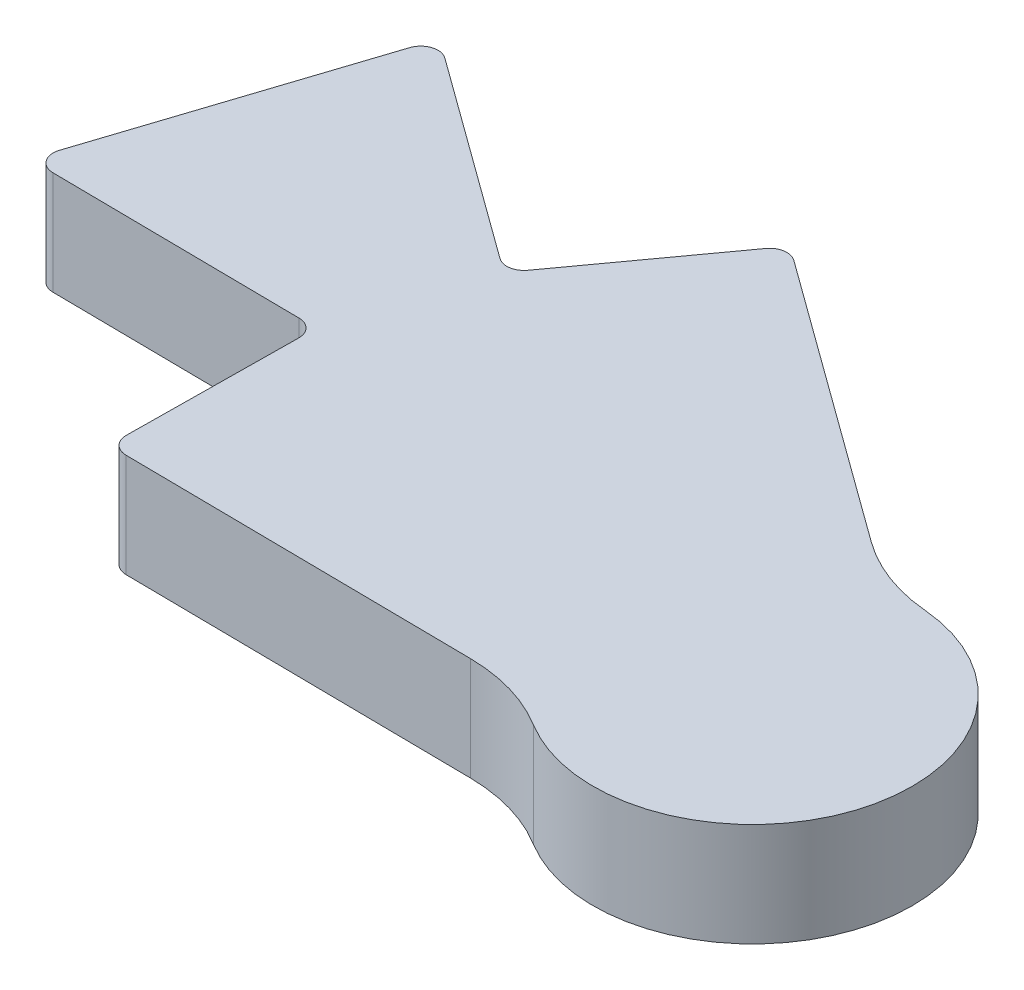
ISO-10303-21;
HEADER;
FILE_DESCRIPTION(('STEP AP214'),'2;1');
FILE_NAME('part.step','',(''),(''),'','','');
FILE_SCHEMA(('AUTOMOTIVE_DESIGN { 1 0 10303 214 1 1 1 1 }'));
ENDSEC;
DATA;
#1=APPLICATION_CONTEXT('core data for automotive mechanical design processes');
#2=APPLICATION_PROTOCOL_DEFINITION('international standard','automotive_design',2000,#1);
#3=PRODUCT_CONTEXT('',#1,'mechanical');
#4=PRODUCT('Part','Part','',(#3));
#5=PRODUCT_RELATED_PRODUCT_CATEGORY('part','',(#4));
#6=PRODUCT_DEFINITION_FORMATION('','',#4);
#7=PRODUCT_DEFINITION_CONTEXT('part definition',#1,'design');
#8=PRODUCT_DEFINITION('design','',#6,#7);
#9=PRODUCT_DEFINITION_SHAPE('','',#8);
#10=(LENGTH_UNIT() NAMED_UNIT(*) SI_UNIT(.MILLI.,.METRE.));
#11=(NAMED_UNIT(*) PLANE_ANGLE_UNIT() SI_UNIT($,.RADIAN.));
#12=(NAMED_UNIT(*) SI_UNIT($,.STERADIAN.) SOLID_ANGLE_UNIT());
#13=UNCERTAINTY_MEASURE_WITH_UNIT(LENGTH_MEASURE(1.E-05),#10,'distance_accuracy_value','');
#14=(GEOMETRIC_REPRESENTATION_CONTEXT(3) GLOBAL_UNCERTAINTY_ASSIGNED_CONTEXT((#13)) GLOBAL_UNIT_ASSIGNED_CONTEXT((#10,
#11,#12)) REPRESENTATION_CONTEXT('',''));
#15=CARTESIAN_POINT('',(0.,0.,0.));
#16=DIRECTION('',(0.,0.,1.));
#17=DIRECTION('',(1.,0.,0.));
#18=AXIS2_PLACEMENT_3D('',#15,#16,#17);
#19=CARTESIAN_POINT('',(-45.4404288981152,-113.282323344771,-24.3949893348608));
#20=DIRECTION('',(0.,1.,0.));
#21=DIRECTION('',(0.,0.,1.));
#22=AXIS2_PLACEMENT_3D('',#19,#20,#21);
#23=CYLINDRICAL_SURFACE('',#22,1.5875);
#24=CARTESIAN_POINT('',(-45.4404288981152,-9.52499999999999,-24.3949893348608));
#25=DIRECTION('',(0.,1.,0.));
#26=DIRECTION('',(0.,0.,1.));
#27=AXIS2_PLACEMENT_3D('',#24,#25,#26);
#28=CIRCLE('',#27,1.5875);
#29=CARTESIAN_POINT('',(-46.3730351959528,-9.52500000000001,-23.1103097081704));
#30=VERTEX_POINT('',#29);
#31=CARTESIAN_POINT('',(-44.1557492714247,-9.525,-23.4623830370232));
#32=VERTEX_POINT('',#31);
#33=EDGE_CURVE('E46',#30,#32,#28,.T.);
#34=ORIENTED_EDGE('',*,*,#33,.F.);
#35=DIRECTION('',(0.,1.,0.));
#36=VECTOR('',#35,1.);
#37=CARTESIAN_POINT('',(-46.3730351959528,-113.282323344771,-23.1103097081704));
#38=LINE('',#37,#36);
#39=CARTESIAN_POINT('',(-46.3730351959528,0.,-23.1103097081704));
#40=VERTEX_POINT('',#39);
#41=EDGE_CURVE('E149',#30,#40,#38,.T.);
#42=ORIENTED_EDGE('',*,*,#41,.T.);
#43=CARTESIAN_POINT('',(-45.4404288981152,0.,-24.3949893348608));
#44=DIRECTION('',(0.,-1.,0.));
#45=DIRECTION('',(0.,0.,1.));
#46=AXIS2_PLACEMENT_3D('',#43,#44,#45);
#47=CIRCLE('',#46,1.5875);
#48=CARTESIAN_POINT('',(-44.1557492714247,0.,-23.4623830370232));
#49=VERTEX_POINT('',#48);
#50=EDGE_CURVE('E153',#49,#40,#47,.T.);
#51=ORIENTED_EDGE('',*,*,#50,.F.);
#52=DIRECTION('',(0.,1.,0.));
#53=VECTOR('',#52,1.);
#54=CARTESIAN_POINT('',(-44.1557492714247,-113.282323344771,-23.4623830370232));
#55=LINE('',#54,#53);
#56=EDGE_CURVE('E212',#32,#49,#55,.T.);
#57=ORIENTED_EDGE('',*,*,#56,.F.);
#58=EDGE_LOOP('',(#34,#42,#51,#57));
#59=FACE_BOUND('',#58,.T.);
#60=ADVANCED_FACE('F39',(#59),#23,.F.);
#61=CARTESIAN_POINT('',(-34.941599048791,-113.282323344771,-36.1550177487226));
#62=DIRECTION('',(-0.809247008938891,0.,-0.58746853407094));
#63=DIRECTION('',(-0.58746853407094,0.,0.809247008938891));
#64=AXIS2_PLACEMENT_3D('',#61,#62,#63);
#65=PLANE('',#64);
#66=DIRECTION('',(0.58746853407094,0.,-0.809247008938891));
#67=VECTOR('',#66,1.);
#68=CARTESIAN_POINT('',(-34.9415990487915,-9.52499999999987,-36.1550177487219));
#69=LINE('',#68,#67);
#70=CARTESIAN_POINT('',(-34.941599048791,-9.52499999999985,-36.1550177487226));
#71=VERTEX_POINT('',#70);
#72=EDGE_CURVE('E312',#32,#71,#69,.T.);
#73=ORIENTED_EDGE('',*,*,#72,.F.);
#74=ORIENTED_EDGE('',*,*,#56,.T.);
#75=DIRECTION('',(-0.58746853407094,0.,0.809247008938891));
#76=VECTOR('',#75,1.);
#77=CARTESIAN_POINT('',(-34.941599048791,0.,-36.1550177487226));
#78=LINE('',#77,#76);
#79=CARTESIAN_POINT('',(-34.941599048791,0.,-36.1550177487226));
#80=VERTEX_POINT('',#79);
#81=EDGE_CURVE('E158',#80,#49,#78,.T.);
#82=ORIENTED_EDGE('',*,*,#81,.F.);
#83=DIRECTION('',(0.,1.,0.));
#84=VECTOR('',#83,1.);
#85=CARTESIAN_POINT('',(-34.941599048791,-113.282323344771,-36.1550177487226));
#86=LINE('',#85,#84);
#87=EDGE_CURVE('E215',#71,#80,#86,.T.);
#88=ORIENTED_EDGE('',*,*,#87,.F.);
#89=EDGE_LOOP('',(#73,#74,#82,#88));
#90=FACE_BOUND('',#89,.T.);
#91=ADVANCED_FACE('F311',(#90),#65,.T.);
#92=CARTESIAN_POINT('',(-33.6569194221005,-113.282323344771,-35.222411450885));
#93=DIRECTION('',(0.,1.,0.));
#94=DIRECTION('',(0.,0.,1.));
#95=AXIS2_PLACEMENT_3D('',#92,#93,#94);
#96=CYLINDRICAL_SURFACE('',#95,1.5875);
#97=CARTESIAN_POINT('',(-33.6569194221005,-9.52499999999985,-35.222411450885));
#98=DIRECTION('',(0.,1.,0.));
#99=DIRECTION('',(0.,0.,1.));
#100=AXIS2_PLACEMENT_3D('',#97,#98,#99);
#101=CIRCLE('',#100,1.5875);
#102=CARTESIAN_POINT('',(-32.7243131242629,-9.52499999999986,-36.5070910775755));
#103=VERTEX_POINT('',#102);
#104=EDGE_CURVE('E308',#71,#103,#101,.F.);
#105=ORIENTED_EDGE('',*,*,#104,.F.);
#106=ORIENTED_EDGE('',*,*,#87,.T.);
#107=CARTESIAN_POINT('',(-33.6569194221005,0.,-35.222411450885));
#108=DIRECTION('',(0.,1.,0.));
#109=DIRECTION('',(0.,0.,1.));
#110=AXIS2_PLACEMENT_3D('',#107,#108,#109);
#111=CIRCLE('',#110,1.5875);
#112=CARTESIAN_POINT('',(-32.7243131242629,0.,-36.5070910775755));
#113=VERTEX_POINT('',#112);
#114=EDGE_CURVE('E209',#113,#80,#111,.T.);
#115=ORIENTED_EDGE('',*,*,#114,.F.);
#116=DIRECTION('',(0.,1.,0.));
#117=VECTOR('',#116,1.);
#118=CARTESIAN_POINT('',(-32.7243131242629,-113.282323344771,-36.5070910775755));
#119=LINE('',#118,#117);
#120=EDGE_CURVE('E217',#103,#113,#119,.T.);
#121=ORIENTED_EDGE('',*,*,#120,.F.);
#122=EDGE_LOOP('',(#105,#106,#115,#121));
#123=FACE_BOUND('',#122,.T.);
#124=ADVANCED_FACE('F306',(#123),#96,.T.);
#125=CARTESIAN_POINT('',(-6.67101029497955,-113.282323344771,-17.5938353574284));
#126=DIRECTION('',(0.587468534070942,0.,-0.809247008938889));
#127=DIRECTION('',(-0.809247008938889,0.,-0.587468534070942));
#128=AXIS2_PLACEMENT_3D('',#125,#126,#127);
#129=PLANE('',#128);
#130=DIRECTION('',(0.809247008938889,0.,0.587468534070942));
#131=VECTOR('',#130,1.);
#132=CARTESIAN_POINT('',(-6.67101029497945,-9.5249999999999,-17.5938353574283));
#133=LINE('',#132,#131);
#134=CARTESIAN_POINT('',(-6.67101029497957,-9.52499999999989,-17.5938353574283));
#135=VERTEX_POINT('',#134);
#136=EDGE_CURVE('E303',#103,#135,#133,.T.);
#137=ORIENTED_EDGE('',*,*,#136,.F.);
#138=ORIENTED_EDGE('',*,*,#120,.T.);
#139=DIRECTION('',(-0.809247008938889,0.,-0.587468534070941));
#140=VECTOR('',#139,1.);
#141=CARTESIAN_POINT('',(-6.67101029497955,0.,-17.5938353574284));
#142=LINE('',#141,#140);
#143=CARTESIAN_POINT('',(-6.67101029497957,0.,-17.5938353574283));
#144=VERTEX_POINT('',#143);
#145=EDGE_CURVE('E206',#144,#113,#142,.T.);
#146=ORIENTED_EDGE('',*,*,#145,.F.);
#147=DIRECTION('',(0.,1.,0.));
#148=VECTOR('',#147,1.);
#149=CARTESIAN_POINT('',(-6.67101029497957,-113.282323344771,-17.5938353574283));
#150=LINE('',#149,#148);
#151=EDGE_CURVE('E219',#135,#144,#150,.T.);
#152=ORIENTED_EDGE('',*,*,#151,.F.);
#153=EDGE_LOOP('',(#137,#138,#146,#152));
#154=FACE_BOUND('',#153,.T.);
#155=ADVANCED_FACE('F301',(#154),#129,.T.);
#156=CARTESIAN_POINT('',(2.65505268339514,-113.282323344771,-30.4406316243323));
#157=DIRECTION('',(0.,1.,0.));
#158=DIRECTION('',(0.,0.,1.));
#159=AXIS2_PLACEMENT_3D('',#156,#157,#158);
#160=CYLINDRICAL_SURFACE('',#159,15.8749999999984);
#161=CARTESIAN_POINT('',(2.65505268339514,-9.52499999999976,-30.4406316243323));
#162=DIRECTION('',(0.,1.,0.));
#163=DIRECTION('',(0.,0.,1.));
#164=AXIS2_PLACEMENT_3D('',#161,#162,#163);
#165=CIRCLE('',#164,15.8749999999984);
#166=CARTESIAN_POINT('',(1.27566122277845,-9.52499999999988,-14.6256733822652));
#167=VERTEX_POINT('',#166);
#168=EDGE_CURVE('E316',#135,#167,#165,.T.);
#169=ORIENTED_EDGE('',*,*,#168,.F.);
#170=ORIENTED_EDGE('',*,*,#151,.T.);
#171=CARTESIAN_POINT('',(2.65505268339514,0.,-30.4406316243323));
#172=DIRECTION('',(0.,-1.,0.));
#173=DIRECTION('',(0.,0.,1.));
#174=AXIS2_PLACEMENT_3D('',#171,#172,#173);
#175=CIRCLE('',#174,15.8749999999984);
#176=CARTESIAN_POINT('',(1.27566122277845,0.,-14.6256733822652));
#177=VERTEX_POINT('',#176);
#178=EDGE_CURVE('E203',#177,#144,#175,.T.);
#179=ORIENTED_EDGE('',*,*,#178,.F.);
#180=DIRECTION('',(0.,1.,0.));
#181=VECTOR('',#180,1.);
#182=CARTESIAN_POINT('',(1.27566122277845,-113.282323344771,-14.6256733822652));
#183=LINE('',#182,#181);
#184=EDGE_CURVE('E221',#167,#177,#183,.T.);
#185=ORIENTED_EDGE('',*,*,#184,.F.);
#186=EDGE_LOOP('',(#169,#170,#179,#185));
#187=FACE_BOUND('',#186,.T.);
#188=ADVANCED_FACE('F295',(#187),#160,.F.);
#189=CARTESIAN_POINT('',(0.,-113.282323344771,0.));
#190=DIRECTION('',(0.,1.,0.));
#191=DIRECTION('',(0.,0.,1.));
#192=AXIS2_PLACEMENT_3D('',#189,#190,#191);
#193=CYLINDRICAL_SURFACE('',#192,14.6812);
#194=CARTESIAN_POINT('',(0.,-9.52499999999999,0.));
#195=DIRECTION('',(0.,1.,0.));
#196=DIRECTION('',(0.,0.,1.));
#197=AXIS2_PLACEMENT_3D('',#194,#195,#196);
#198=CIRCLE('',#197,14.6812);
#199=CARTESIAN_POINT('',(-7.70155333243296,-9.52500000000011,12.4989483440684));
#200=VERTEX_POINT('',#199);
#201=EDGE_CURVE('E292',#167,#200,#198,.F.);
#202=ORIENTED_EDGE('',*,*,#201,.F.);
#203=ORIENTED_EDGE('',*,*,#184,.T.);
#204=CARTESIAN_POINT('',(0.,0.,0.));
#205=DIRECTION('',(0.,1.,0.));
#206=DIRECTION('',(0.,0.,1.));
#207=AXIS2_PLACEMENT_3D('',#204,#205,#206);
#208=CIRCLE('',#207,14.6812);
#209=CARTESIAN_POINT('',(-7.70155333243296,0.,12.4989483440684));
#210=VERTEX_POINT('',#209);
#211=EDGE_CURVE('E200',#210,#177,#208,.T.);
#212=ORIENTED_EDGE('',*,*,#211,.F.);
#213=DIRECTION('',(0.,1.,0.));
#214=VECTOR('',#213,1.);
#215=CARTESIAN_POINT('',(-7.70155333243296,-113.282323344771,12.4989483440684));
#216=LINE('',#215,#214);
#217=EDGE_CURVE('E223',#200,#210,#216,.T.);
#218=ORIENTED_EDGE('',*,*,#217,.F.);
#219=EDGE_LOOP('',(#202,#203,#212,#218));
#220=FACE_BOUND('',#219,.T.);
#221=ADVANCED_FACE('F289',(#220),#193,.T.);
#222=CARTESIAN_POINT('',(-16.0293575413778,-113.282323344771,26.01424715902));
#223=DIRECTION('',(0.,1.,0.));
#224=DIRECTION('',(0.,0.,1.));
#225=AXIS2_PLACEMENT_3D('',#222,#223,#224);
#226=CYLINDRICAL_SURFACE('',#225,15.8749999999984);
#227=CARTESIAN_POINT('',(-16.0293575413778,-9.52500000000024,26.01424715902));
#228=DIRECTION('',(0.,1.,0.));
#229=DIRECTION('',(0.,0.,1.));
#230=AXIS2_PLACEMENT_3D('',#227,#228,#229);
#231=CIRCLE('',#230,15.8749999999984);
#232=CARTESIAN_POINT('',(-15.8499377236947,-9.52500000000012,10.1402610959994));
#233=VERTEX_POINT('',#232);
#234=EDGE_CURVE('E286',#200,#233,#231,.T.);
#235=ORIENTED_EDGE('',*,*,#234,.F.);
#236=ORIENTED_EDGE('',*,*,#217,.T.);
#237=CARTESIAN_POINT('',(-16.0293575413778,0.,26.01424715902));
#238=DIRECTION('',(0.,-1.,0.));
#239=DIRECTION('',(0.,0.,1.));
#240=AXIS2_PLACEMENT_3D('',#237,#238,#239);
#241=CIRCLE('',#240,15.8749999999984);
#242=CARTESIAN_POINT('',(-15.8499377236947,0.,10.1402610959994));
#243=VERTEX_POINT('',#242);
#244=EDGE_CURVE('E197',#243,#210,#241,.T.);
#245=ORIENTED_EDGE('',*,*,#244,.F.);
#246=DIRECTION('',(0.,1.,0.));
#247=VECTOR('',#246,1.);
#248=CARTESIAN_POINT('',(-15.8499377236947,-113.282323344771,10.1402610959994));
#249=LINE('',#248,#247);
#250=EDGE_CURVE('E225',#233,#243,#249,.T.);
#251=ORIENTED_EDGE('',*,*,#250,.F.);
#252=EDGE_LOOP('',(#235,#236,#245,#251));
#253=FACE_BOUND('',#252,.T.);
#254=ADVANCED_FACE('F284',(#253),#226,.F.);
#255=CARTESIAN_POINT('',(-47.9153895709995,-113.282323344771,9.77783306427944));
#256=DIRECTION('',(-0.0113020357595672,0.,0.999936129954153));
#257=DIRECTION('',(0.999936129954153,0.,0.0113020357595672));
#258=AXIS2_PLACEMENT_3D('',#255,#256,#257);
#259=PLANE('',#258);
#260=DIRECTION('',(-0.999936129954153,0.,-0.0113020357595672));
#261=VECTOR('',#260,1.);
#262=CARTESIAN_POINT('',(-47.9153895709999,-9.52500000000024,9.77783306427943));
#263=LINE('',#262,#261);
#264=CARTESIAN_POINT('',(-47.9153895709995,-9.52500000000024,9.77783306427944));
#265=VERTEX_POINT('',#264);
#266=EDGE_CURVE('E320',#233,#265,#263,.T.);
#267=ORIENTED_EDGE('',*,*,#266,.F.);
#268=ORIENTED_EDGE('',*,*,#250,.T.);
#269=DIRECTION('',(0.999936129954153,0.,0.0113020357595672));
#270=VECTOR('',#269,1.);
#271=CARTESIAN_POINT('',(-47.9153895709995,0.,9.77783306427944));
#272=LINE('',#271,#270);
#273=CARTESIAN_POINT('',(-47.9153895709995,0.,9.77783306427944));
#274=VERTEX_POINT('',#273);
#275=EDGE_CURVE('E194',#274,#243,#272,.T.);
#276=ORIENTED_EDGE('',*,*,#275,.F.);
#277=DIRECTION('',(0.,1.,0.));
#278=VECTOR('',#277,1.);
#279=CARTESIAN_POINT('',(-47.9153895709995,-113.282323344771,9.77783306427944));
#280=LINE('',#279,#278);
#281=EDGE_CURVE('E227',#265,#274,#280,.T.);
#282=ORIENTED_EDGE('',*,*,#281,.F.);
#283=EDGE_LOOP('',(#267,#268,#276,#282));
#284=FACE_BOUND('',#283,.T.);
#285=ADVANCED_FACE('F278',(#284),#259,.T.);
#286=CARTESIAN_POINT('',(-47.8974475892312,-113.282323344771,8.19043445797722));
#287=DIRECTION('',(0.,1.,0.));
#288=DIRECTION('',(0.,0.,1.));
#289=AXIS2_PLACEMENT_3D('',#286,#287,#288);
#290=CYLINDRICAL_SURFACE('',#289,1.5875);
#291=CARTESIAN_POINT('',(-47.8974475892312,-9.52500000000023,8.19043445797722));
#292=DIRECTION('',(0.,1.,0.));
#293=DIRECTION('',(0.,0.,1.));
#294=AXIS2_PLACEMENT_3D('',#291,#292,#293);
#295=CIRCLE('',#294,1.5875);
#296=CARTESIAN_POINT('',(-49.4848461955334,-9.52500000000025,8.1724924762089));
#297=VERTEX_POINT('',#296);
#298=EDGE_CURVE('E275',#265,#297,#295,.F.);
#299=ORIENTED_EDGE('',*,*,#298,.F.);
#300=ORIENTED_EDGE('',*,*,#281,.T.);
#301=CARTESIAN_POINT('',(-47.8974475892312,0.,8.19043445797722));
#302=DIRECTION('',(0.,1.,0.));
#303=DIRECTION('',(0.,0.,1.));
#304=AXIS2_PLACEMENT_3D('',#301,#302,#303);
#305=CIRCLE('',#304,1.5875);
#306=CARTESIAN_POINT('',(-49.4848461955334,0.,8.1724924762089));
#307=VERTEX_POINT('',#306);
#308=EDGE_CURVE('E191',#307,#274,#305,.T.);
#309=ORIENTED_EDGE('',*,*,#308,.F.);
#310=DIRECTION('',(0.,1.,0.));
#311=VECTOR('',#310,1.);
#312=CARTESIAN_POINT('',(-49.4848461955334,-113.282323344771,8.1724924762089));
#313=LINE('',#312,#311);
#314=EDGE_CURVE('E229',#297,#307,#313,.T.);
#315=ORIENTED_EDGE('',*,*,#314,.F.);
#316=EDGE_LOOP('',(#299,#300,#309,#315));
#317=FACE_BOUND('',#316,.T.);
#318=ADVANCED_FACE('F272',(#317),#290,.T.);
#319=CARTESIAN_POINT('',(-49.3075794156626,-113.282323344771,-7.5110057540538));
#320=DIRECTION('',(-0.999936129954153,0.,-0.0113020357595675));
#321=DIRECTION('',(-0.0113020357595675,0.,0.999936129954153));
#322=AXIS2_PLACEMENT_3D('',#319,#320,#321);
#323=PLANE('',#322);
#324=DIRECTION('',(0.0113020357595675,0.,-0.999936129954153));
#325=VECTOR('',#324,1.);
#326=CARTESIAN_POINT('',(-49.3075794156626,-9.52500000000013,-7.51100575405304));
#327=LINE('',#326,#325);
#328=CARTESIAN_POINT('',(-49.3075794156626,-9.52500000000012,-7.5110057540538));
#329=VERTEX_POINT('',#328);
#330=EDGE_CURVE('E269',#297,#329,#327,.T.);
#331=ORIENTED_EDGE('',*,*,#330,.F.);
#332=ORIENTED_EDGE('',*,*,#314,.T.);
#333=DIRECTION('',(-0.0113020357595675,0.,0.999936129954153));
#334=VECTOR('',#333,1.);
#335=CARTESIAN_POINT('',(-49.3075794156626,0.,-7.5110057540538));
#336=LINE('',#335,#334);
#337=CARTESIAN_POINT('',(-49.3075794156626,0.,-7.5110057540538));
#338=VERTEX_POINT('',#337);
#339=EDGE_CURVE('E188',#338,#307,#336,.T.);
#340=ORIENTED_EDGE('',*,*,#339,.F.);
#341=DIRECTION('',(0.,1.,0.));
#342=VECTOR('',#341,1.);
#343=CARTESIAN_POINT('',(-49.3075794156626,-113.282323344771,-7.5110057540538));
#344=LINE('',#343,#342);
#345=EDGE_CURVE('E231',#329,#338,#344,.T.);
#346=ORIENTED_EDGE('',*,*,#345,.F.);
#347=EDGE_LOOP('',(#331,#332,#340,#346));
#348=FACE_BOUND('',#347,.T.);
#349=ADVANCED_FACE('F267',(#348),#323,.T.);
#350=CARTESIAN_POINT('',(-50.8949780219648,-113.282323344771,-7.52894773582211));
#351=DIRECTION('',(0.,1.,0.));
#352=DIRECTION('',(0.,0.,1.));
#353=AXIS2_PLACEMENT_3D('',#350,#351,#352);
#354=CYLINDRICAL_SURFACE('',#353,1.5875);
#355=CARTESIAN_POINT('',(-50.8949780219648,-9.52500000000013,-7.52894773582211));
#356=DIRECTION('',(0.,1.,0.));
#357=DIRECTION('',(0.,0.,1.));
#358=AXIS2_PLACEMENT_3D('',#355,#356,#357);
#359=CIRCLE('',#358,1.5875);
#360=CARTESIAN_POINT('',(-50.8770360401964,-9.52500000000013,-9.11634634212433));
#361=VERTEX_POINT('',#360);
#362=EDGE_CURVE('E324',#329,#361,#359,.T.);
#363=ORIENTED_EDGE('',*,*,#362,.F.);
#364=ORIENTED_EDGE('',*,*,#345,.T.);
#365=CARTESIAN_POINT('',(-50.8949780219648,0.,-7.52894773582211));
#366=DIRECTION('',(0.,-1.,0.));
#367=DIRECTION('',(0.,0.,1.));
#368=AXIS2_PLACEMENT_3D('',#365,#366,#367);
#369=CIRCLE('',#368,1.5875);
#370=CARTESIAN_POINT('',(-50.8770360401964,0.,-9.11634634212433));
#371=VERTEX_POINT('',#370);
#372=EDGE_CURVE('E185',#371,#338,#369,.T.);
#373=ORIENTED_EDGE('',*,*,#372,.F.);
#374=DIRECTION('',(0.,1.,0.));
#375=VECTOR('',#374,1.);
#376=CARTESIAN_POINT('',(-50.8770360401964,-113.282323344771,-9.11634634212433));
#377=LINE('',#376,#375);
#378=EDGE_CURVE('E233',#361,#371,#377,.T.);
#379=ORIENTED_EDGE('',*,*,#378,.F.);
#380=EDGE_LOOP('',(#363,#364,#373,#379));
#381=FACE_BOUND('',#380,.T.);
#382=ADVANCED_FACE('F261',(#381),#354,.F.);
#383=CARTESIAN_POINT('',(-73.7956363051794,-113.282323344771,-9.37538972699128));
#384=DIRECTION('',(-0.0113020357595678,0.,0.999936129954153));
#385=DIRECTION('',(0.999936129954153,0.,0.0113020357595678));
#386=AXIS2_PLACEMENT_3D('',#383,#384,#385);
#387=PLANE('',#386);
#388=DIRECTION('',(-0.999936129954153,0.,-0.0113020357595678));
#389=VECTOR('',#388,1.);
#390=CARTESIAN_POINT('',(-73.7956363051798,-9.52500000000021,-9.37538972699128));
#391=LINE('',#390,#389);
#392=CARTESIAN_POINT('',(-73.7956363051794,-9.52500000000021,-9.37538972699128));
#393=VERTEX_POINT('',#392);
#394=EDGE_CURVE('E258',#361,#393,#391,.T.);
#395=ORIENTED_EDGE('',*,*,#394,.F.);
#396=ORIENTED_EDGE('',*,*,#378,.T.);
#397=DIRECTION('',(0.999936129954153,0.,0.0113020357595678));
#398=VECTOR('',#397,1.);
#399=CARTESIAN_POINT('',(-73.7956363051794,0.,-9.37538972699128));
#400=LINE('',#399,#398);
#401=CARTESIAN_POINT('',(-73.7956363051794,0.,-9.37538972699128));
#402=VERTEX_POINT('',#401);
#403=EDGE_CURVE('E182',#402,#371,#400,.T.);
#404=ORIENTED_EDGE('',*,*,#403,.F.);
#405=DIRECTION('',(0.,1.,0.));
#406=VECTOR('',#405,1.);
#407=CARTESIAN_POINT('',(-73.7956363051794,-113.282323344771,-9.37538972699128));
#408=LINE('',#407,#406);
#409=EDGE_CURVE('E235',#393,#402,#408,.T.);
#410=ORIENTED_EDGE('',*,*,#409,.F.);
#411=EDGE_LOOP('',(#395,#396,#404,#410));
#412=FACE_BOUND('',#411,.T.);
#413=ADVANCED_FACE('F255',(#412),#387,.T.);
#414=CARTESIAN_POINT('',(-73.7776943234111,-113.282323344771,-10.9627883332935));
#415=DIRECTION('',(0.,1.,0.));
#416=DIRECTION('',(0.,0.,1.));
#417=AXIS2_PLACEMENT_3D('',#414,#415,#416);
#418=CYLINDRICAL_SURFACE('',#417,1.5875);
#419=CARTESIAN_POINT('',(-73.7776943234111,-9.5250000000002,-10.9627883332935));
#420=DIRECTION('',(0.,1.,0.));
#421=DIRECTION('',(0.,0.,1.));
#422=AXIS2_PLACEMENT_3D('',#419,#420,#421);
#423=CIRCLE('',#422,1.5875);
#424=CARTESIAN_POINT('',(-75.2868026802018,-9.5250000000002,-11.4554831855746));
#425=VERTEX_POINT('',#424);
#426=EDGE_CURVE('E58',#393,#425,#423,.F.);
#427=ORIENTED_EDGE('',*,*,#426,.F.);
#428=ORIENTED_EDGE('',*,*,#409,.T.);
#429=CARTESIAN_POINT('',(-73.7776943234111,0.,-10.9627883332935));
#430=DIRECTION('',(0.,1.,0.));
#431=DIRECTION('',(0.,0.,1.));
#432=AXIS2_PLACEMENT_3D('',#429,#430,#431);
#433=CIRCLE('',#432,1.5875);
#434=CARTESIAN_POINT('',(-75.2868026802018,0.,-11.4554831855745));
#435=VERTEX_POINT('',#434);
#436=EDGE_CURVE('E179',#435,#402,#433,.T.);
#437=ORIENTED_EDGE('',*,*,#436,.F.);
#438=DIRECTION('',(0.,1.,0.));
#439=VECTOR('',#438,1.);
#440=CARTESIAN_POINT('',(-75.2868026802018,-113.282323344771,-11.4554831855745));
#441=LINE('',#440,#439);
#442=EDGE_CURVE('E237',#425,#435,#441,.T.);
#443=ORIENTED_EDGE('',*,*,#442,.F.);
#444=EDGE_LOOP('',(#427,#428,#437,#443));
#445=FACE_BOUND('',#444,.T.);
#446=ADVANCED_FACE('F251',(#445),#418,.T.);
#447=CARTESIAN_POINT('',(-67.3478257310173,-113.282323344771,-35.7723121577378));
#448=DIRECTION('',(-0.950619437348518,0.,-0.310358962066808));
#449=DIRECTION('',(-0.310358962066808,0.,0.950619437348518));
#450=AXIS2_PLACEMENT_3D('',#447,#448,#449);
#451=PLANE('',#450);
#452=DIRECTION('',(0.310358962066808,0.,-0.950619437348518));
#453=VECTOR('',#452,1.);
#454=CARTESIAN_POINT('',(-67.3478257310176,-9.52499999999999,-35.772312157737));
#455=LINE('',#454,#453);
#456=CARTESIAN_POINT('',(-67.3478257310173,-9.52499999999998,-35.7723121577378));
#457=VERTEX_POINT('',#456);
#458=EDGE_CURVE('E53',#425,#457,#455,.T.);
#459=ORIENTED_EDGE('',*,*,#458,.F.);
#460=ORIENTED_EDGE('',*,*,#442,.T.);
#461=DIRECTION('',(-0.310358962066808,0.,0.950619437348518));
#462=VECTOR('',#461,1.);
#463=CARTESIAN_POINT('',(-67.3478257310173,0.,-35.7723121577378));
#464=LINE('',#463,#462);
#465=CARTESIAN_POINT('',(-67.3478257310173,0.,-35.7723121577378));
#466=VERTEX_POINT('',#465);
#467=EDGE_CURVE('E176',#466,#435,#464,.T.);
#468=ORIENTED_EDGE('',*,*,#467,.F.);
#469=DIRECTION('',(0.,1.,0.));
#470=VECTOR('',#469,1.);
#471=CARTESIAN_POINT('',(-67.3478257310173,-113.282323344771,-35.7723121577378));
#472=LINE('',#471,#470);
#473=EDGE_CURVE('E239',#457,#466,#472,.T.);
#474=ORIENTED_EDGE('',*,*,#473,.F.);
#475=EDGE_LOOP('',(#459,#460,#468,#474));
#476=FACE_BOUND('',#475,.T.);
#477=ADVANCED_FACE('F246',(#476),#451,.T.);
#478=CARTESIAN_POINT('',(-65.8387173742265,-113.282323344771,-35.2796173054567));
#479=DIRECTION('',(0.,1.,0.));
#480=DIRECTION('',(0.,0.,1.));
#481=AXIS2_PLACEMENT_3D('',#478,#479,#480);
#482=CYLINDRICAL_SURFACE('',#481,1.58750000000001);
#483=CARTESIAN_POINT('',(-65.8387173742265,-9.52499999999998,-35.2796173054567));
#484=DIRECTION('',(0.,1.,0.));
#485=DIRECTION('',(0.,0.,1.));
#486=AXIS2_PLACEMENT_3D('',#483,#484,#485);
#487=CIRCLE('',#486,1.58750000000001);
#488=CARTESIAN_POINT('',(-64.9061110763889,-9.52499999999999,-36.5642969321472));
#489=VERTEX_POINT('',#488);
#490=EDGE_CURVE('E214',#457,#489,#487,.F.);
#491=ORIENTED_EDGE('',*,*,#490,.F.);
#492=ORIENTED_EDGE('',*,*,#473,.T.);
#493=CARTESIAN_POINT('',(-65.8387173742265,0.,-35.2796173054567));
#494=DIRECTION('',(0.,1.,0.));
#495=DIRECTION('',(0.,0.,1.));
#496=AXIS2_PLACEMENT_3D('',#493,#494,#495);
#497=CIRCLE('',#496,1.58750000000001);
#498=CARTESIAN_POINT('',(-64.9061110763889,0.,-36.5642969321472));
#499=VERTEX_POINT('',#498);
#500=EDGE_CURVE('E166',#499,#466,#497,.T.);
#501=ORIENTED_EDGE('',*,*,#500,.F.);
#502=DIRECTION('',(0.,1.,0.));
#503=VECTOR('',#502,1.);
#504=CARTESIAN_POINT('',(-64.9061110763889,-113.282323344771,-36.5642969321472));
#505=LINE('',#504,#503);
#506=EDGE_CURVE('E157',#489,#499,#505,.T.);
#507=ORIENTED_EDGE('',*,*,#506,.F.);
#508=EDGE_LOOP('',(#491,#492,#501,#507));
#509=FACE_BOUND('',#508,.T.);
#510=ADVANCED_FACE('F244',(#509),#482,.T.);
#511=CARTESIAN_POINT('',(-46.3730351959528,-113.282323344771,-23.1103097081704));
#512=DIRECTION('',(0.587468534070942,0.,-0.809247008938889));
#513=DIRECTION('',(-0.809247008938889,0.,-0.587468534070942));
#514=AXIS2_PLACEMENT_3D('',#511,#512,#513);
#515=PLANE('',#514);
#516=DIRECTION('',(0.809247008938889,0.,0.587468534070942));
#517=VECTOR('',#516,1.);
#518=CARTESIAN_POINT('',(-46.3730351959527,-9.52500000000001,-23.1103097081703));
#519=LINE('',#518,#517);
#520=EDGE_CURVE('E11',#489,#30,#519,.T.);
#521=ORIENTED_EDGE('',*,*,#520,.F.);
#522=ORIENTED_EDGE('',*,*,#506,.T.);
#523=DIRECTION('',(-0.809247008938889,0.,-0.587468534070942));
#524=VECTOR('',#523,1.);
#525=CARTESIAN_POINT('',(-46.3730351959528,0.,-23.1103097081704));
#526=LINE('',#525,#524);
#527=EDGE_CURVE('E160',#40,#499,#526,.T.);
#528=ORIENTED_EDGE('',*,*,#527,.F.);
#529=ORIENTED_EDGE('',*,*,#41,.F.);
#530=EDGE_LOOP('',(#521,#522,#528,#529));
#531=FACE_BOUND('',#530,.T.);
#532=ADVANCED_FACE('F161',(#531),#515,.T.);
#533=CARTESIAN_POINT('',(-45.4404288981152,0.,-24.3949893348608));
#534=DIRECTION('',(0.,1.,0.));
#535=DIRECTION('',(0.,0.,1.));
#536=AXIS2_PLACEMENT_3D('',#533,#534,#535);
#537=PLANE('',#536);
#538=ORIENTED_EDGE('',*,*,#50,.T.);
#539=ORIENTED_EDGE('',*,*,#527,.T.);
#540=ORIENTED_EDGE('',*,*,#500,.T.);
#541=ORIENTED_EDGE('',*,*,#467,.T.);
#542=ORIENTED_EDGE('',*,*,#436,.T.);
#543=ORIENTED_EDGE('',*,*,#403,.T.);
#544=ORIENTED_EDGE('',*,*,#372,.T.);
#545=ORIENTED_EDGE('',*,*,#339,.T.);
#546=ORIENTED_EDGE('',*,*,#308,.T.);
#547=ORIENTED_EDGE('',*,*,#275,.T.);
#548=ORIENTED_EDGE('',*,*,#244,.T.);
#549=ORIENTED_EDGE('',*,*,#211,.T.);
#550=ORIENTED_EDGE('',*,*,#178,.T.);
#551=ORIENTED_EDGE('',*,*,#145,.T.);
#552=ORIENTED_EDGE('',*,*,#114,.T.);
#553=ORIENTED_EDGE('',*,*,#81,.T.);
#554=EDGE_LOOP('',(#538,#539,#540,#541,#542,#543,#544,#545,#546,#547,#548,#549,#550,#551,#552,#553));
#555=FACE_BOUND('',#554,.T.);
#556=ADVANCED_FACE('F168',(#555),#537,.T.);
#557=CARTESIAN_POINT('',(0.,-9.52499999999999,0.));
#558=DIRECTION('',(0.,1.,0.));
#559=DIRECTION('',(-0.950619437348518,0.,-0.310358962066808));
#560=AXIS2_PLACEMENT_3D('',#557,#558,#559);
#561=PLANE('',#560);
#562=ORIENTED_EDGE('',*,*,#33,.T.);
#563=ORIENTED_EDGE('',*,*,#72,.T.);
#564=ORIENTED_EDGE('',*,*,#104,.T.);
#565=ORIENTED_EDGE('',*,*,#136,.T.);
#566=ORIENTED_EDGE('',*,*,#168,.T.);
#567=ORIENTED_EDGE('',*,*,#201,.T.);
#568=ORIENTED_EDGE('',*,*,#234,.T.);
#569=ORIENTED_EDGE('',*,*,#266,.T.);
#570=ORIENTED_EDGE('',*,*,#298,.T.);
#571=ORIENTED_EDGE('',*,*,#330,.T.);
#572=ORIENTED_EDGE('',*,*,#362,.T.);
#573=ORIENTED_EDGE('',*,*,#394,.T.);
#574=ORIENTED_EDGE('',*,*,#426,.T.);
#575=ORIENTED_EDGE('',*,*,#458,.T.);
#576=ORIENTED_EDGE('',*,*,#490,.T.);
#577=ORIENTED_EDGE('',*,*,#520,.T.);
#578=EDGE_LOOP('',(#562,#563,#564,#565,#566,#567,#568,#569,#570,#571,#572,#573,#574,#575,#576,#577));
#579=FACE_BOUND('',#578,.T.);
#580=ADVANCED_FACE('F329',(#579),#561,.F.);
#581=CLOSED_SHELL('',(#60,#91,#124,#155,#188,#221,#254,#285,#318,#349,#382,#413,#446,#477,#510,
#532,#556,#580));
#582=MANIFOLD_SOLID_BREP('B2',#581);
#583=ADVANCED_BREP_SHAPE_REPRESENTATION('',(#18,#582),#14);
#584=SHAPE_DEFINITION_REPRESENTATION(#9,#583);
ENDSEC;
END-ISO-10303-21;
